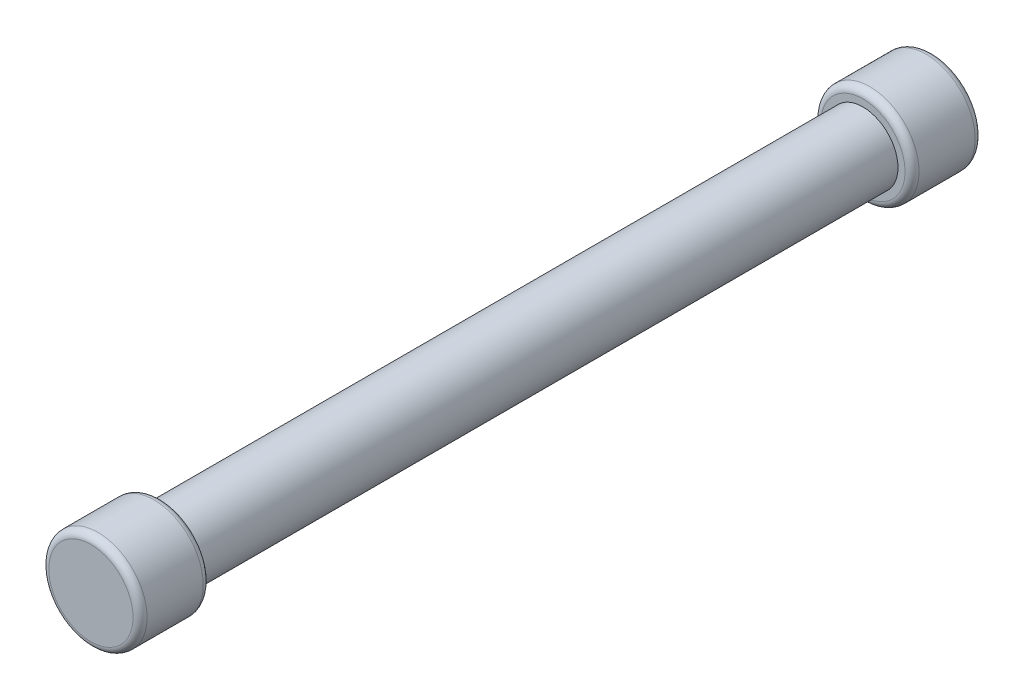
ISO-10303-21;
HEADER;
FILE_DESCRIPTION(('STEP AP214'),'2;1');
FILE_NAME('part.step','',(''),(''),'','','');
FILE_SCHEMA(('AUTOMOTIVE_DESIGN { 1 0 10303 214 1 1 1 1 }'));
ENDSEC;
DATA;
#1=APPLICATION_CONTEXT('core data for automotive mechanical design processes');
#2=APPLICATION_PROTOCOL_DEFINITION('international standard','automotive_design',2000,#1);
#3=PRODUCT_CONTEXT('',#1,'mechanical');
#4=PRODUCT('Part','Part','',(#3));
#5=PRODUCT_RELATED_PRODUCT_CATEGORY('part','',(#4));
#6=PRODUCT_DEFINITION_FORMATION('','',#4);
#7=PRODUCT_DEFINITION_CONTEXT('part definition',#1,'design');
#8=PRODUCT_DEFINITION('design','',#6,#7);
#9=PRODUCT_DEFINITION_SHAPE('','',#8);
#10=(LENGTH_UNIT() NAMED_UNIT(*) SI_UNIT(.MILLI.,.METRE.));
#11=(NAMED_UNIT(*) PLANE_ANGLE_UNIT() SI_UNIT($,.RADIAN.));
#12=(NAMED_UNIT(*) SI_UNIT($,.STERADIAN.) SOLID_ANGLE_UNIT());
#13=UNCERTAINTY_MEASURE_WITH_UNIT(LENGTH_MEASURE(1.E-05),#10,'distance_accuracy_value','');
#14=(GEOMETRIC_REPRESENTATION_CONTEXT(3) GLOBAL_UNCERTAINTY_ASSIGNED_CONTEXT((#13)) GLOBAL_UNIT_ASSIGNED_CONTEXT((#10,
#11,#12)) REPRESENTATION_CONTEXT('',''));
#15=CARTESIAN_POINT('',(0.,0.,0.));
#16=DIRECTION('',(0.,0.,1.));
#17=DIRECTION('',(1.,0.,0.));
#18=AXIS2_PLACEMENT_3D('',#15,#16,#17);
#19=CARTESIAN_POINT('',(0.,0.,5.));
#20=DIRECTION('',(0.,0.,-1.));
#21=DIRECTION('',(-1.,0.,0.));
#22=AXIS2_PLACEMENT_3D('',#19,#20,#21);
#23=CYLINDRICAL_SURFACE('',#22,3.5);
#24=CARTESIAN_POINT('',(0.,0.,4.5));
#25=DIRECTION('',(0.,0.,1.));
#26=DIRECTION('',(1.,0.,0.));
#27=AXIS2_PLACEMENT_3D('',#24,#25,#26);
#28=CIRCLE('',#27,3.5);
#29=CARTESIAN_POINT('',(3.5,0.,4.5));
#30=VERTEX_POINT('',#29);
#31=EDGE_CURVE('E54',#30,#30,#28,.F.);
#32=ORIENTED_EDGE('',*,*,#31,.T.);
#33=EDGE_LOOP('',(#32));
#34=FACE_BOUND('',#33,.T.);
#35=CARTESIAN_POINT('',(0.,0.,0.5));
#36=DIRECTION('',(0.,0.,1.));
#37=DIRECTION('',(1.,0.,0.));
#38=AXIS2_PLACEMENT_3D('',#35,#36,#37);
#39=CIRCLE('',#38,3.5);
#40=CARTESIAN_POINT('',(3.5,0.,0.5));
#41=VERTEX_POINT('',#40);
#42=EDGE_CURVE('E57',#41,#41,#39,.T.);
#43=ORIENTED_EDGE('',*,*,#42,.T.);
#44=EDGE_LOOP('',(#43));
#45=FACE_BOUND('',#44,.T.);
#46=ADVANCED_FACE('F31',(#34,#45),#23,.T.);
#47=CARTESIAN_POINT('',(0.,0.,5.));
#48=DIRECTION('',(0.,0.,1.));
#49=DIRECTION('',(1.,0.,0.));
#50=AXIS2_PLACEMENT_3D('',#47,#48,#49);
#51=PLANE('',#50);
#52=CARTESIAN_POINT('',(0.,0.,5.));
#53=DIRECTION('',(0.,0.,1.));
#54=DIRECTION('',(1.,0.,0.));
#55=AXIS2_PLACEMENT_3D('',#52,#53,#54);
#56=CIRCLE('',#55,3.);
#57=CARTESIAN_POINT('',(3.,0.,5.));
#58=VERTEX_POINT('',#57);
#59=EDGE_CURVE('E60',#58,#58,#56,.T.);
#60=ORIENTED_EDGE('',*,*,#59,.T.);
#61=EDGE_LOOP('',(#60));
#62=FACE_BOUND('',#61,.T.);
#63=ADVANCED_FACE('F81',(#62),#51,.T.);
#64=CARTESIAN_POINT('',(0.,0.,0.));
#65=DIRECTION('',(0.,0.,1.));
#66=DIRECTION('',(1.,0.,0.));
#67=AXIS2_PLACEMENT_3D('',#64,#65,#66);
#68=PLANE('',#67);
#69=CARTESIAN_POINT('',(0.,0.,0.));
#70=DIRECTION('',(0.,0.,1.));
#71=DIRECTION('',(1.,0.,0.));
#72=AXIS2_PLACEMENT_3D('',#69,#70,#71);
#73=CIRCLE('',#72,3.);
#74=CARTESIAN_POINT('',(3.,0.,0.));
#75=VERTEX_POINT('',#74);
#76=EDGE_CURVE('E51',#75,#75,#73,.F.);
#77=ORIENTED_EDGE('',*,*,#76,.T.);
#78=EDGE_LOOP('',(#77));
#79=FACE_BOUND('',#78,.T.);
#80=CARTESIAN_POINT('',(0.,0.,0.));
#81=DIRECTION('',(0.,0.,1.));
#82=DIRECTION('',(1.,0.,0.));
#83=AXIS2_PLACEMENT_3D('',#80,#81,#82);
#84=CIRCLE('',#83,2.5);
#85=CARTESIAN_POINT('',(2.5,0.,0.));
#86=VERTEX_POINT('',#85);
#87=EDGE_CURVE('E63',#86,#86,#84,.F.);
#88=ORIENTED_EDGE('',*,*,#87,.F.);
#89=EDGE_LOOP('',(#88));
#90=FACE_BOUND('',#89,.T.);
#91=ADVANCED_FACE('F76',(#79,#90),#68,.F.);
#92=CARTESIAN_POINT('',(0.,0.,-50.));
#93=DIRECTION('',(0.,0.,1.));
#94=DIRECTION('',(1.,0.,0.));
#95=AXIS2_PLACEMENT_3D('',#92,#93,#94);
#96=CYLINDRICAL_SURFACE('',#95,2.5);
#97=CARTESIAN_POINT('',(0.,0.,-50.));
#98=DIRECTION('',(0.,0.,-1.));
#99=DIRECTION('',(-1.,0.,0.));
#100=AXIS2_PLACEMENT_3D('',#97,#98,#99);
#101=CIRCLE('',#100,2.5);
#102=CARTESIAN_POINT('',(-2.5,0.,-50.));
#103=VERTEX_POINT('',#102);
#104=EDGE_CURVE('E66',#103,#103,#101,.T.);
#105=ORIENTED_EDGE('',*,*,#104,.F.);
#106=EDGE_LOOP('',(#105));
#107=FACE_BOUND('',#106,.T.);
#108=ORIENTED_EDGE('',*,*,#87,.T.);
#109=EDGE_LOOP('',(#108));
#110=FACE_BOUND('',#109,.T.);
#111=ADVANCED_FACE('F72',(#107,#110),#96,.T.);
#112=CARTESIAN_POINT('',(0.,0.,-55.));
#113=DIRECTION('',(0.,0.,1.));
#114=DIRECTION('',(1.,0.,0.));
#115=AXIS2_PLACEMENT_3D('',#112,#113,#114);
#116=CYLINDRICAL_SURFACE('',#115,3.5);
#117=CARTESIAN_POINT('',(0.,0.,-50.5));
#118=DIRECTION('',(0.,0.,-1.));
#119=DIRECTION('',(-1.,0.,0.));
#120=AXIS2_PLACEMENT_3D('',#117,#118,#119);
#121=CIRCLE('',#120,3.5);
#122=CARTESIAN_POINT('',(-3.5,0.,-50.5));
#123=VERTEX_POINT('',#122);
#124=EDGE_CURVE('E42',#123,#123,#121,.T.);
#125=ORIENTED_EDGE('',*,*,#124,.T.);
#126=EDGE_LOOP('',(#125));
#127=FACE_BOUND('',#126,.T.);
#128=CARTESIAN_POINT('',(0.,0.,-54.5));
#129=DIRECTION('',(0.,0.,-1.));
#130=DIRECTION('',(-1.,0.,0.));
#131=AXIS2_PLACEMENT_3D('',#128,#129,#130);
#132=CIRCLE('',#131,3.5);
#133=CARTESIAN_POINT('',(-3.5,0.,-54.5));
#134=VERTEX_POINT('',#133);
#135=EDGE_CURVE('E46',#134,#134,#132,.F.);
#136=ORIENTED_EDGE('',*,*,#135,.T.);
#137=EDGE_LOOP('',(#136));
#138=FACE_BOUND('',#137,.T.);
#139=ADVANCED_FACE('F75',(#127,#138),#116,.T.);
#140=CARTESIAN_POINT('',(0.,0.,-55.));
#141=DIRECTION('',(0.,0.,-1.));
#142=DIRECTION('',(-1.,0.,0.));
#143=AXIS2_PLACEMENT_3D('',#140,#141,#142);
#144=PLANE('',#143);
#145=CARTESIAN_POINT('',(0.,0.,-55.));
#146=DIRECTION('',(0.,0.,-1.));
#147=DIRECTION('',(-1.,0.,0.));
#148=AXIS2_PLACEMENT_3D('',#145,#146,#147);
#149=CIRCLE('',#148,3.);
#150=CARTESIAN_POINT('',(-3.,0.,-55.));
#151=VERTEX_POINT('',#150);
#152=EDGE_CURVE('E10',#151,#151,#149,.T.);
#153=ORIENTED_EDGE('',*,*,#152,.T.);
#154=EDGE_LOOP('',(#153));
#155=FACE_BOUND('',#154,.T.);
#156=ADVANCED_FACE('F115',(#155),#144,.T.);
#157=CARTESIAN_POINT('',(0.,0.,-50.));
#158=DIRECTION('',(0.,0.,-1.));
#159=DIRECTION('',(-1.,0.,0.));
#160=AXIS2_PLACEMENT_3D('',#157,#158,#159);
#161=PLANE('',#160);
#162=CARTESIAN_POINT('',(0.,0.,-50.));
#163=DIRECTION('',(0.,0.,-1.));
#164=DIRECTION('',(-1.,0.,0.));
#165=AXIS2_PLACEMENT_3D('',#162,#163,#164);
#166=CIRCLE('',#165,3.);
#167=CARTESIAN_POINT('',(-3.,0.,-50.));
#168=VERTEX_POINT('',#167);
#169=EDGE_CURVE('E38',#168,#168,#166,.F.);
#170=ORIENTED_EDGE('',*,*,#169,.T.);
#171=EDGE_LOOP('',(#170));
#172=FACE_BOUND('',#171,.T.);
#173=ORIENTED_EDGE('',*,*,#104,.T.);
#174=EDGE_LOOP('',(#173));
#175=FACE_BOUND('',#174,.T.);
#176=ADVANCED_FACE('F70',(#172,#175),#161,.F.);
#177=CARTESIAN_POINT('',(0.,0.,4.5));
#178=DIRECTION('',(0.,0.,1.));
#179=DIRECTION('',(1.,0.,0.));
#180=AXIS2_PLACEMENT_3D('',#177,#178,#179);
#181=TOROIDAL_SURFACE('',#180,3.,0.5);
#182=ORIENTED_EDGE('',*,*,#31,.F.);
#183=EDGE_LOOP('',(#182));
#184=FACE_BOUND('',#183,.T.);
#185=ORIENTED_EDGE('',*,*,#59,.F.);
#186=EDGE_LOOP('',(#185));
#187=FACE_BOUND('',#186,.T.);
#188=ADVANCED_FACE('F96',(#184,#187),#181,.T.);
#189=CARTESIAN_POINT('',(0.,0.,0.5));
#190=DIRECTION('',(0.,0.,1.));
#191=DIRECTION('',(1.,0.,0.));
#192=AXIS2_PLACEMENT_3D('',#189,#190,#191);
#193=TOROIDAL_SURFACE('',#192,3.,0.5);
#194=ORIENTED_EDGE('',*,*,#76,.F.);
#195=EDGE_LOOP('',(#194));
#196=FACE_BOUND('',#195,.T.);
#197=ORIENTED_EDGE('',*,*,#42,.F.);
#198=EDGE_LOOP('',(#197));
#199=FACE_BOUND('',#198,.T.);
#200=ADVANCED_FACE('F99',(#196,#199),#193,.T.);
#201=CARTESIAN_POINT('',(0.,0.,-50.5));
#202=DIRECTION('',(0.,0.,-1.));
#203=DIRECTION('',(-1.,0.,0.));
#204=AXIS2_PLACEMENT_3D('',#201,#202,#203);
#205=TOROIDAL_SURFACE('',#204,3.,0.5);
#206=ORIENTED_EDGE('',*,*,#169,.F.);
#207=EDGE_LOOP('',(#206));
#208=FACE_BOUND('',#207,.T.);
#209=ORIENTED_EDGE('',*,*,#124,.F.);
#210=EDGE_LOOP('',(#209));
#211=FACE_BOUND('',#210,.T.);
#212=ADVANCED_FACE('F102',(#208,#211),#205,.T.);
#213=CARTESIAN_POINT('',(0.,0.,-54.5));
#214=DIRECTION('',(0.,0.,-1.));
#215=DIRECTION('',(-1.,0.,0.));
#216=AXIS2_PLACEMENT_3D('',#213,#214,#215);
#217=TOROIDAL_SURFACE('',#216,3.,0.5);
#218=ORIENTED_EDGE('',*,*,#135,.F.);
#219=EDGE_LOOP('',(#218));
#220=FACE_BOUND('',#219,.T.);
#221=ORIENTED_EDGE('',*,*,#152,.F.);
#222=EDGE_LOOP('',(#221));
#223=FACE_BOUND('',#222,.T.);
#224=ADVANCED_FACE('F33',(#220,#223),#217,.T.);
#225=CLOSED_SHELL('',(#46,#63,#91,#111,#139,#156,#176,#188,#200,#212,#224));
#226=MANIFOLD_SOLID_BREP('B2',#225);
#227=ADVANCED_BREP_SHAPE_REPRESENTATION('',(#18,#226),#14);
#228=SHAPE_DEFINITION_REPRESENTATION(#9,#227);
ENDSEC;
END-ISO-10303-21;
